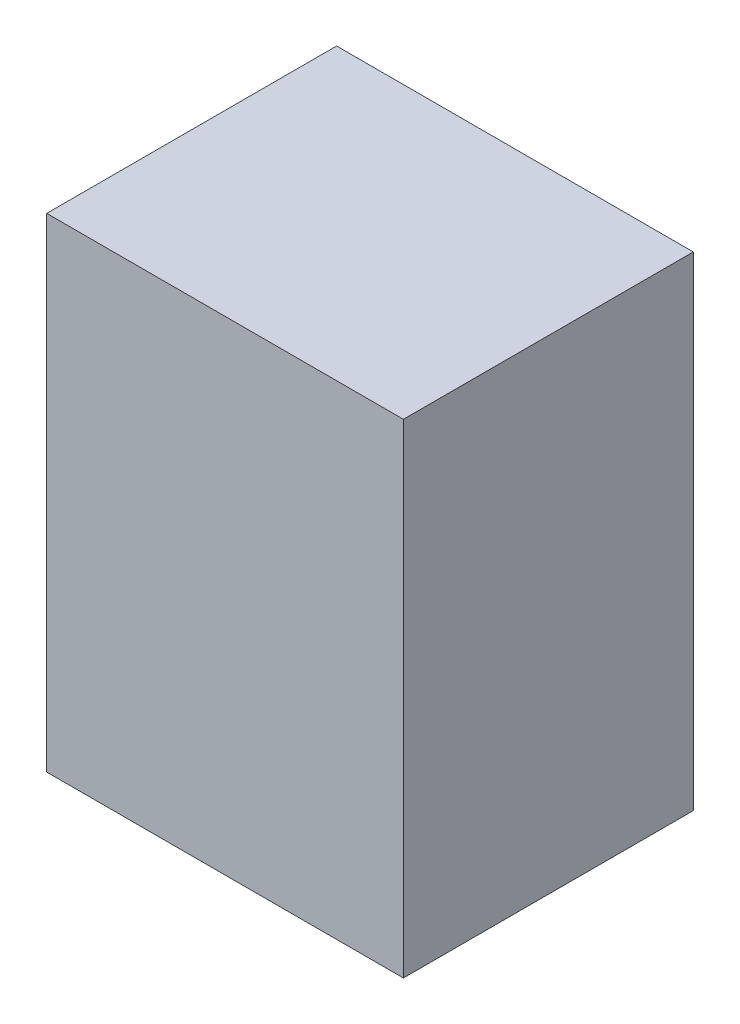
ISO-10303-21;
HEADER;
FILE_DESCRIPTION(('STEP AP214'),'2;1');
FILE_NAME('part.step','',(''),(''),'','','');
FILE_SCHEMA(('AUTOMOTIVE_DESIGN { 1 0 10303 214 1 1 1 1 }'));
ENDSEC;
DATA;
#1=APPLICATION_CONTEXT('core data for automotive mechanical design processes');
#2=APPLICATION_PROTOCOL_DEFINITION('international standard','automotive_design',2000,#1);
#3=PRODUCT_CONTEXT('',#1,'mechanical');
#4=PRODUCT('Part','Part','',(#3));
#5=PRODUCT_RELATED_PRODUCT_CATEGORY('part','',(#4));
#6=PRODUCT_DEFINITION_FORMATION('','',#4);
#7=PRODUCT_DEFINITION_CONTEXT('part definition',#1,'design');
#8=PRODUCT_DEFINITION('design','',#6,#7);
#9=PRODUCT_DEFINITION_SHAPE('','',#8);
#10=(LENGTH_UNIT() NAMED_UNIT(*) SI_UNIT(.MILLI.,.METRE.));
#11=(NAMED_UNIT(*) PLANE_ANGLE_UNIT() SI_UNIT($,.RADIAN.));
#12=(NAMED_UNIT(*) SI_UNIT($,.STERADIAN.) SOLID_ANGLE_UNIT());
#13=UNCERTAINTY_MEASURE_WITH_UNIT(LENGTH_MEASURE(1.E-05),#10,'distance_accuracy_value','');
#14=(GEOMETRIC_REPRESENTATION_CONTEXT(3) GLOBAL_UNCERTAINTY_ASSIGNED_CONTEXT((#13)) GLOBAL_UNIT_ASSIGNED_CONTEXT((#10,
#11,#12)) REPRESENTATION_CONTEXT('',''));
#15=CARTESIAN_POINT('',(0.,0.,0.));
#16=DIRECTION('',(0.,0.,1.));
#17=DIRECTION('',(1.,0.,0.));
#18=AXIS2_PLACEMENT_3D('',#15,#16,#17);
#19=CARTESIAN_POINT('',(-53.7355,77.5714301256037,7.25));
#20=DIRECTION('',(0.,1.,0.));
#21=DIRECTION('',(0.,0.,1.));
#22=AXIS2_PLACEMENT_3D('',#19,#20,#21);
#23=PLANE('',#22);
#24=DIRECTION('',(1.,0.,0.));
#25=VECTOR('',#24,1.);
#26=CARTESIAN_POINT('',(-53.7355,77.5714301256037,0.));
#27=LINE('',#26,#25);
#28=CARTESIAN_POINT('',(-53.7355,77.5714301256037,0.));
#29=VERTEX_POINT('',#28);
#30=CARTESIAN_POINT('',(-44.8155,77.5714301256037,0.));
#31=VERTEX_POINT('',#30);
#32=EDGE_CURVE('E113',#29,#31,#27,.T.);
#33=ORIENTED_EDGE('',*,*,#32,.F.);
#34=DIRECTION('',(0.,0.,-1.));
#35=VECTOR('',#34,1.);
#36=CARTESIAN_POINT('',(-53.7355,77.5714301256037,7.25));
#37=LINE('',#36,#35);
#38=CARTESIAN_POINT('',(-53.7355,77.5714301256037,7.25));
#39=VERTEX_POINT('',#38);
#40=EDGE_CURVE('E11',#39,#29,#37,.T.);
#41=ORIENTED_EDGE('',*,*,#40,.F.);
#42=DIRECTION('',(1.,0.,0.));
#43=VECTOR('',#42,1.);
#44=CARTESIAN_POINT('',(-53.7355,77.5714301256037,7.25));
#45=LINE('',#44,#43);
#46=CARTESIAN_POINT('',(-44.8155,77.5714301256037,7.25));
#47=VERTEX_POINT('',#46);
#48=EDGE_CURVE('E143',#39,#47,#45,.T.);
#49=ORIENTED_EDGE('',*,*,#48,.T.);
#50=DIRECTION('',(0.,0.,-1.));
#51=VECTOR('',#50,1.);
#52=CARTESIAN_POINT('',(-44.8155,77.5714301256037,7.25));
#53=LINE('',#52,#51);
#54=EDGE_CURVE('E35',#47,#31,#53,.T.);
#55=ORIENTED_EDGE('',*,*,#54,.T.);
#56=EDGE_LOOP('',(#33,#41,#49,#55));
#57=FACE_BOUND('',#56,.T.);
#58=ADVANCED_FACE('F32',(#57),#23,.T.);
#59=CARTESIAN_POINT('',(-53.7355,77.5714301256037,7.25));
#60=DIRECTION('',(1.,0.,0.));
#61=DIRECTION('',(0.,0.,-1.));
#62=AXIS2_PLACEMENT_3D('',#59,#60,#61);
#63=PLANE('',#62);
#64=DIRECTION('',(0.,-1.,0.));
#65=VECTOR('',#64,1.);
#66=CARTESIAN_POINT('',(-53.7355,77.5714301256037,0.));
#67=LINE('',#66,#65);
#68=CARTESIAN_POINT('',(-53.7355,65.47,0.));
#69=VERTEX_POINT('',#68);
#70=EDGE_CURVE('E146',#29,#69,#67,.T.);
#71=ORIENTED_EDGE('',*,*,#70,.T.);
#72=DIRECTION('',(0.,0.,-1.));
#73=VECTOR('',#72,1.);
#74=CARTESIAN_POINT('',(-53.7355,65.47,7.25));
#75=LINE('',#74,#73);
#76=CARTESIAN_POINT('',(-53.7355,65.47,7.25));
#77=VERTEX_POINT('',#76);
#78=EDGE_CURVE('E40',#77,#69,#75,.T.);
#79=ORIENTED_EDGE('',*,*,#78,.F.);
#80=DIRECTION('',(0.,-1.,0.));
#81=VECTOR('',#80,1.);
#82=CARTESIAN_POINT('',(-53.7355,77.5714301256037,7.25));
#83=LINE('',#82,#81);
#84=EDGE_CURVE('E150',#39,#77,#83,.T.);
#85=ORIENTED_EDGE('',*,*,#84,.F.);
#86=ORIENTED_EDGE('',*,*,#40,.T.);
#87=EDGE_LOOP('',(#71,#79,#85,#86));
#88=FACE_BOUND('',#87,.T.);
#89=ADVANCED_FACE('F170',(#88),#63,.F.);
#90=CARTESIAN_POINT('',(-53.7355,65.47,7.25));
#91=DIRECTION('',(0.,1.,0.));
#92=DIRECTION('',(0.,0.,1.));
#93=AXIS2_PLACEMENT_3D('',#90,#91,#92);
#94=PLANE('',#93);
#95=DIRECTION('',(1.,0.,0.));
#96=VECTOR('',#95,1.);
#97=CARTESIAN_POINT('',(-53.7355,65.47,0.));
#98=LINE('',#97,#96);
#99=CARTESIAN_POINT('',(-44.8155,65.47,0.));
#100=VERTEX_POINT('',#99);
#101=EDGE_CURVE('E157',#69,#100,#98,.T.);
#102=ORIENTED_EDGE('',*,*,#101,.T.);
#103=DIRECTION('',(0.,0.,-1.));
#104=VECTOR('',#103,1.);
#105=CARTESIAN_POINT('',(-44.8155,65.47,7.25));
#106=LINE('',#105,#104);
#107=CARTESIAN_POINT('',(-44.8155,65.47,7.25));
#108=VERTEX_POINT('',#107);
#109=EDGE_CURVE('E162',#108,#100,#106,.T.);
#110=ORIENTED_EDGE('',*,*,#109,.F.);
#111=DIRECTION('',(1.,0.,0.));
#112=VECTOR('',#111,1.);
#113=CARTESIAN_POINT('',(-53.7355,65.47,7.25));
#114=LINE('',#113,#112);
#115=EDGE_CURVE('E148',#77,#108,#114,.T.);
#116=ORIENTED_EDGE('',*,*,#115,.F.);
#117=ORIENTED_EDGE('',*,*,#78,.T.);
#118=EDGE_LOOP('',(#102,#110,#116,#117));
#119=FACE_BOUND('',#118,.T.);
#120=ADVANCED_FACE('F173',(#119),#94,.F.);
#121=CARTESIAN_POINT('',(-44.8155,77.5714301256037,7.25));
#122=DIRECTION('',(1.,0.,0.));
#123=DIRECTION('',(0.,0.,-1.));
#124=AXIS2_PLACEMENT_3D('',#121,#122,#123);
#125=PLANE('',#124);
#126=DIRECTION('',(0.,-1.,0.));
#127=VECTOR('',#126,1.);
#128=CARTESIAN_POINT('',(-44.8155,77.5714301256037,0.));
#129=LINE('',#128,#127);
#130=EDGE_CURVE('E154',#31,#100,#129,.T.);
#131=ORIENTED_EDGE('',*,*,#130,.F.);
#132=ORIENTED_EDGE('',*,*,#54,.F.);
#133=DIRECTION('',(0.,-1.,0.));
#134=VECTOR('',#133,1.);
#135=CARTESIAN_POINT('',(-44.8155,77.5714301256037,7.25));
#136=LINE('',#135,#134);
#137=EDGE_CURVE('E145',#47,#108,#136,.T.);
#138=ORIENTED_EDGE('',*,*,#137,.T.);
#139=ORIENTED_EDGE('',*,*,#109,.T.);
#140=EDGE_LOOP('',(#131,#132,#138,#139));
#141=FACE_BOUND('',#140,.T.);
#142=ADVANCED_FACE('F165',(#141),#125,.T.);
#143=CARTESIAN_POINT('',(0.,0.,7.25));
#144=DIRECTION('',(0.,0.,-1.));
#145=DIRECTION('',(-1.,0.,0.));
#146=AXIS2_PLACEMENT_3D('',#143,#144,#145);
#147=PLANE('',#146);
#148=ORIENTED_EDGE('',*,*,#48,.F.);
#149=ORIENTED_EDGE('',*,*,#84,.T.);
#150=ORIENTED_EDGE('',*,*,#115,.T.);
#151=ORIENTED_EDGE('',*,*,#137,.F.);
#152=EDGE_LOOP('',(#148,#149,#150,#151));
#153=FACE_BOUND('',#152,.T.);
#154=ADVANCED_FACE('F175',(#153),#147,.F.);
#155=CARTESIAN_POINT('',(0.,0.,0.));
#156=DIRECTION('',(0.,0.,-1.));
#157=DIRECTION('',(-1.,0.,0.));
#158=AXIS2_PLACEMENT_3D('',#155,#156,#157);
#159=PLANE('',#158);
#160=DIRECTION('',(1.,0.,0.));
#161=VECTOR('',#160,1.);
#162=CARTESIAN_POINT('',(0.,77.0714301256037,0.));
#163=LINE('',#162,#161);
#164=CARTESIAN_POINT('',(-53.2355,77.0714301256037,0.));
#165=VERTEX_POINT('',#164);
#166=CARTESIAN_POINT('',(-45.3155,77.0714301256037,0.));
#167=VERTEX_POINT('',#166);
#168=EDGE_CURVE('E137',#165,#167,#163,.T.);
#169=ORIENTED_EDGE('',*,*,#168,.F.);
#170=DIRECTION('',(0.,-1.,0.));
#171=VECTOR('',#170,1.);
#172=CARTESIAN_POINT('',(-53.2355,0.,0.));
#173=LINE('',#172,#171);
#174=CARTESIAN_POINT('',(-53.2355,65.97,0.));
#175=VERTEX_POINT('',#174);
#176=EDGE_CURVE('E108',#165,#175,#173,.T.);
#177=ORIENTED_EDGE('',*,*,#176,.T.);
#178=DIRECTION('',(1.,0.,0.));
#179=VECTOR('',#178,1.);
#180=CARTESIAN_POINT('',(0.,65.97,0.));
#181=LINE('',#180,#179);
#182=CARTESIAN_POINT('',(-45.3155,65.97,0.));
#183=VERTEX_POINT('',#182);
#184=EDGE_CURVE('E48',#175,#183,#181,.T.);
#185=ORIENTED_EDGE('',*,*,#184,.T.);
#186=DIRECTION('',(0.,-1.,0.));
#187=VECTOR('',#186,1.);
#188=CARTESIAN_POINT('',(-45.3155,0.,0.));
#189=LINE('',#188,#187);
#190=EDGE_CURVE('E139',#167,#183,#189,.T.);
#191=ORIENTED_EDGE('',*,*,#190,.F.);
#192=EDGE_LOOP('',(#169,#177,#185,#191));
#193=FACE_BOUND('',#192,.T.);
#194=ORIENTED_EDGE('',*,*,#32,.T.);
#195=ORIENTED_EDGE('',*,*,#130,.T.);
#196=ORIENTED_EDGE('',*,*,#101,.F.);
#197=ORIENTED_EDGE('',*,*,#70,.F.);
#198=EDGE_LOOP('',(#194,#195,#196,#197));
#199=FACE_BOUND('',#198,.T.);
#200=ADVANCED_FACE('F168',(#193,#199),#159,.T.);
#201=CARTESIAN_POINT('',(-53.7355,77.0714301256037,7.25));
#202=DIRECTION('',(0.,1.,0.));
#203=DIRECTION('',(0.,0.,1.));
#204=AXIS2_PLACEMENT_3D('',#201,#202,#203);
#205=PLANE('',#204);
#206=ORIENTED_EDGE('',*,*,#168,.T.);
#207=DIRECTION('',(0.,0.,-1.));
#208=VECTOR('',#207,1.);
#209=CARTESIAN_POINT('',(-45.3155,77.0714301256037,7.25));
#210=LINE('',#209,#208);
#211=CARTESIAN_POINT('',(-45.3155,77.0714301256037,7.05));
#212=VERTEX_POINT('',#211);
#213=EDGE_CURVE('E123',#212,#167,#210,.T.);
#214=ORIENTED_EDGE('',*,*,#213,.F.);
#215=DIRECTION('',(1.,0.,0.));
#216=VECTOR('',#215,1.);
#217=CARTESIAN_POINT('',(0.,77.0714301256037,7.05));
#218=LINE('',#217,#216);
#219=CARTESIAN_POINT('',(-53.2355,77.0714301256037,7.05));
#220=VERTEX_POINT('',#219);
#221=EDGE_CURVE('E121',#220,#212,#218,.T.);
#222=ORIENTED_EDGE('',*,*,#221,.F.);
#223=DIRECTION('',(0.,0.,-1.));
#224=VECTOR('',#223,1.);
#225=CARTESIAN_POINT('',(-53.2355,77.0714301256037,7.25));
#226=LINE('',#225,#224);
#227=EDGE_CURVE('E103',#220,#165,#226,.T.);
#228=ORIENTED_EDGE('',*,*,#227,.T.);
#229=EDGE_LOOP('',(#206,#214,#222,#228));
#230=FACE_BOUND('',#229,.T.);
#231=ADVANCED_FACE('F125',(#230),#205,.F.);
#232=CARTESIAN_POINT('',(-53.2355,77.5714301256037,7.25));
#233=DIRECTION('',(1.,0.,0.));
#234=DIRECTION('',(0.,0.,-1.));
#235=AXIS2_PLACEMENT_3D('',#232,#233,#234);
#236=PLANE('',#235);
#237=ORIENTED_EDGE('',*,*,#176,.F.);
#238=ORIENTED_EDGE('',*,*,#227,.F.);
#239=DIRECTION('',(0.,-1.,0.));
#240=VECTOR('',#239,1.);
#241=CARTESIAN_POINT('',(-53.2355,0.,7.05));
#242=LINE('',#241,#240);
#243=CARTESIAN_POINT('',(-53.2355,65.97,7.05));
#244=VERTEX_POINT('',#243);
#245=EDGE_CURVE('E106',#220,#244,#242,.T.);
#246=ORIENTED_EDGE('',*,*,#245,.T.);
#247=DIRECTION('',(0.,0.,-1.));
#248=VECTOR('',#247,1.);
#249=CARTESIAN_POINT('',(-53.2355,65.97,7.25));
#250=LINE('',#249,#248);
#251=EDGE_CURVE('E114',#244,#175,#250,.T.);
#252=ORIENTED_EDGE('',*,*,#251,.T.);
#253=EDGE_LOOP('',(#237,#238,#246,#252));
#254=FACE_BOUND('',#253,.T.);
#255=ADVANCED_FACE('F105',(#254),#236,.T.);
#256=CARTESIAN_POINT('',(-53.7355,65.97,7.25));
#257=DIRECTION('',(0.,1.,0.));
#258=DIRECTION('',(0.,0.,1.));
#259=AXIS2_PLACEMENT_3D('',#256,#257,#258);
#260=PLANE('',#259);
#261=ORIENTED_EDGE('',*,*,#184,.F.);
#262=ORIENTED_EDGE('',*,*,#251,.F.);
#263=DIRECTION('',(1.,0.,0.));
#264=VECTOR('',#263,1.);
#265=CARTESIAN_POINT('',(0.,65.97,7.05));
#266=LINE('',#265,#264);
#267=CARTESIAN_POINT('',(-45.3155,65.97,7.05));
#268=VERTEX_POINT('',#267);
#269=EDGE_CURVE('E122',#244,#268,#266,.T.);
#270=ORIENTED_EDGE('',*,*,#269,.T.);
#271=DIRECTION('',(0.,0.,-1.));
#272=VECTOR('',#271,1.);
#273=CARTESIAN_POINT('',(-45.3155,65.97,7.25));
#274=LINE('',#273,#272);
#275=EDGE_CURVE('E133',#268,#183,#274,.T.);
#276=ORIENTED_EDGE('',*,*,#275,.T.);
#277=EDGE_LOOP('',(#261,#262,#270,#276));
#278=FACE_BOUND('',#277,.T.);
#279=ADVANCED_FACE('F227',(#278),#260,.T.);
#280=CARTESIAN_POINT('',(-45.3155,77.5714301256037,7.25));
#281=DIRECTION('',(1.,0.,0.));
#282=DIRECTION('',(0.,0.,-1.));
#283=AXIS2_PLACEMENT_3D('',#280,#281,#282);
#284=PLANE('',#283);
#285=ORIENTED_EDGE('',*,*,#190,.T.);
#286=ORIENTED_EDGE('',*,*,#275,.F.);
#287=DIRECTION('',(0.,-1.,0.));
#288=VECTOR('',#287,1.);
#289=CARTESIAN_POINT('',(-45.3155,0.,7.05));
#290=LINE('',#289,#288);
#291=EDGE_CURVE('E127',#212,#268,#290,.T.);
#292=ORIENTED_EDGE('',*,*,#291,.F.);
#293=ORIENTED_EDGE('',*,*,#213,.T.);
#294=EDGE_LOOP('',(#285,#286,#292,#293));
#295=FACE_BOUND('',#294,.T.);
#296=ADVANCED_FACE('F236',(#295),#284,.F.);
#297=CARTESIAN_POINT('',(0.,0.,7.05));
#298=DIRECTION('',(0.,0.,-1.));
#299=DIRECTION('',(-1.,0.,0.));
#300=AXIS2_PLACEMENT_3D('',#297,#298,#299);
#301=PLANE('',#300);
#302=ORIENTED_EDGE('',*,*,#221,.T.);
#303=ORIENTED_EDGE('',*,*,#291,.T.);
#304=ORIENTED_EDGE('',*,*,#269,.F.);
#305=ORIENTED_EDGE('',*,*,#245,.F.);
#306=EDGE_LOOP('',(#302,#303,#304,#305));
#307=FACE_BOUND('',#306,.T.);
#308=ADVANCED_FACE('F119',(#307),#301,.T.);
#309=CLOSED_SHELL('',(#58,#89,#120,#142,#154,#200,#231,#255,#279,#296,#308));
#310=MANIFOLD_SOLID_BREP('B2',#309);
#311=ADVANCED_BREP_SHAPE_REPRESENTATION('',(#18,#310),#14);
#312=SHAPE_DEFINITION_REPRESENTATION(#9,#311);
ENDSEC;
END-ISO-10303-21;
